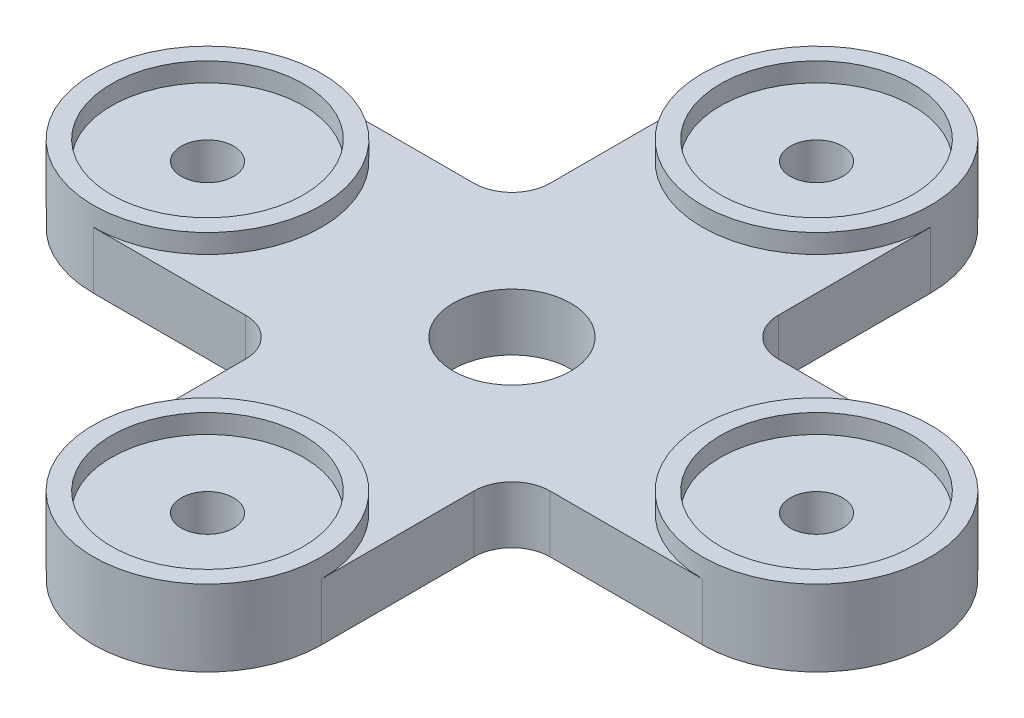
ISO-10303-21;
HEADER;
FILE_DESCRIPTION(('STEP AP214'),'2;1');
FILE_NAME('part.step','',(''),(''),'','','');
FILE_SCHEMA(('AUTOMOTIVE_DESIGN { 1 0 10303 214 1 1 1 1 }'));
ENDSEC;
DATA;
#1=APPLICATION_CONTEXT('core data for automotive mechanical design processes');
#2=APPLICATION_PROTOCOL_DEFINITION('international standard','automotive_design',2000,#1);
#3=PRODUCT_CONTEXT('',#1,'mechanical');
#4=PRODUCT('Part','Part','',(#3));
#5=PRODUCT_RELATED_PRODUCT_CATEGORY('part','',(#4));
#6=PRODUCT_DEFINITION_FORMATION('','',#4);
#7=PRODUCT_DEFINITION_CONTEXT('part definition',#1,'design');
#8=PRODUCT_DEFINITION('design','',#6,#7);
#9=PRODUCT_DEFINITION_SHAPE('','',#8);
#10=(LENGTH_UNIT() NAMED_UNIT(*) SI_UNIT(.MILLI.,.METRE.));
#11=(NAMED_UNIT(*) PLANE_ANGLE_UNIT() SI_UNIT($,.RADIAN.));
#12=(NAMED_UNIT(*) SI_UNIT($,.STERADIAN.) SOLID_ANGLE_UNIT());
#13=UNCERTAINTY_MEASURE_WITH_UNIT(LENGTH_MEASURE(1.E-05),#10,'distance_accuracy_value','');
#14=(GEOMETRIC_REPRESENTATION_CONTEXT(3) GLOBAL_UNCERTAINTY_ASSIGNED_CONTEXT((#13)) GLOBAL_UNIT_ASSIGNED_CONTEXT((#10,
#11,#12)) REPRESENTATION_CONTEXT('',''));
#15=CARTESIAN_POINT('',(0.,0.,0.));
#16=DIRECTION('',(0.,0.,1.));
#17=DIRECTION('',(1.,0.,0.));
#18=AXIS2_PLACEMENT_3D('',#15,#16,#17);
#19=CARTESIAN_POINT('',(7.62000000000001,3.81,0.));
#20=DIRECTION('',(1.,0.,0.));
#21=DIRECTION('',(0.,0.,-1.));
#22=AXIS2_PLACEMENT_3D('',#19,#20,#21);
#23=PLANE('',#22);
#24=DIRECTION('',(0.,0.,1.));
#25=VECTOR('',#24,1.);
#26=CARTESIAN_POINT('',(7.62000000000001,3.81,0.));
#27=LINE('',#26,#25);
#28=CARTESIAN_POINT('',(7.62,3.81,-20.32));
#29=VERTEX_POINT('',#28);
#30=CARTESIAN_POINT('',(7.62,3.81,-10.1600000000001));
#31=VERTEX_POINT('',#30);
#32=EDGE_CURVE('E341',#29,#31,#27,.T.);
#33=ORIENTED_EDGE('',*,*,#32,.T.);
#34=DIRECTION('',(0.,-1.,0.));
#35=VECTOR('',#34,1.);
#36=CARTESIAN_POINT('',(7.62,3.81,-10.1600000000001));
#37=LINE('',#36,#35);
#38=CARTESIAN_POINT('',(7.62,0.,-10.1600000000001));
#39=VERTEX_POINT('',#38);
#40=EDGE_CURVE('E397',#31,#39,#37,.T.);
#41=ORIENTED_EDGE('',*,*,#40,.T.);
#42=DIRECTION('',(0.,0.,1.));
#43=VECTOR('',#42,1.);
#44=CARTESIAN_POINT('',(7.62000000000001,0.,0.));
#45=LINE('',#44,#43);
#46=CARTESIAN_POINT('',(7.62,0.,-20.32));
#47=VERTEX_POINT('',#46);
#48=EDGE_CURVE('E355',#47,#39,#45,.T.);
#49=ORIENTED_EDGE('',*,*,#48,.F.);
#50=DIRECTION('',(0.,-1.,0.));
#51=VECTOR('',#50,1.);
#52=CARTESIAN_POINT('',(7.62,3.81,-20.32));
#53=LINE('',#52,#51);
#54=EDGE_CURVE('E350',#29,#47,#53,.T.);
#55=ORIENTED_EDGE('',*,*,#54,.F.);
#56=EDGE_LOOP('',(#33,#41,#49,#55));
#57=FACE_BOUND('',#56,.T.);
#58=ADVANCED_FACE('F62',(#57),#23,.T.);
#59=CARTESIAN_POINT('',(0.,3.81,0.));
#60=DIRECTION('',(0.,-1.,0.));
#61=DIRECTION('',(0.,0.,-1.));
#62=AXIS2_PLACEMENT_3D('',#59,#60,#61);
#63=CYLINDRICAL_SURFACE('',#62,3.925);
#64=CARTESIAN_POINT('',(0.,3.81,0.));
#65=DIRECTION('',(0.,1.,0.));
#66=DIRECTION('',(0.,0.,1.));
#67=AXIS2_PLACEMENT_3D('',#64,#65,#66);
#68=CIRCLE('',#67,3.925);
#69=CARTESIAN_POINT('',(0.,3.81,-3.925));
#70=VERTEX_POINT('',#69);
#71=EDGE_CURVE('E346',#70,#70,#68,.T.);
#72=CARTESIAN_POINT('',(0.,0.,0.));
#73=DIRECTION('',(0.,1.,0.));
#74=DIRECTION('',(0.,0.,1.));
#75=AXIS2_PLACEMENT_3D('',#72,#73,#74);
#76=CIRCLE('',#75,3.925);
#77=CARTESIAN_POINT('',(0.,0.,-3.925));
#78=VERTEX_POINT('',#77);
#79=EDGE_CURVE('E342',#78,#78,#76,.T.);
#80=CARTESIAN_POINT('',(0.,3.81,-3.925));
#81=CARTESIAN_POINT('',(0.,3.7703125,-3.925));
#82=CARTESIAN_POINT('',(0.,3.730625,-3.925));
#83=CARTESIAN_POINT('',(0.,3.65125,-3.925));
#84=CARTESIAN_POINT('',(0.,3.6115625,-3.925));
#85=CARTESIAN_POINT('',(0.,3.5321875,-3.925));
#86=CARTESIAN_POINT('',(0.,3.4925,-3.925));
#87=CARTESIAN_POINT('',(0.,3.413125,-3.925));
#88=CARTESIAN_POINT('',(0.,3.3734375,-3.925));
#89=CARTESIAN_POINT('',(0.,3.2940625,-3.925));
#90=CARTESIAN_POINT('',(0.,3.254375,-3.925));
#91=CARTESIAN_POINT('',(0.,3.175,-3.925));
#92=CARTESIAN_POINT('',(0.,3.1353125,-3.925));
#93=CARTESIAN_POINT('',(0.,3.0559375,-3.925));
#94=CARTESIAN_POINT('',(0.,3.01625,-3.925));
#95=CARTESIAN_POINT('',(0.,2.936875,-3.925));
#96=CARTESIAN_POINT('',(0.,2.8971875,-3.925));
#97=CARTESIAN_POINT('',(0.,2.8178125,-3.925));
#98=CARTESIAN_POINT('',(0.,2.778125,-3.925));
#99=CARTESIAN_POINT('',(0.,2.69875,-3.925));
#100=CARTESIAN_POINT('',(0.,2.6590625,-3.925));
#101=CARTESIAN_POINT('',(0.,2.5796875,-3.925));
#102=CARTESIAN_POINT('',(0.,2.54,-3.925));
#103=CARTESIAN_POINT('',(0.,2.460625,-3.925));
#104=CARTESIAN_POINT('',(0.,2.4209375,-3.925));
#105=CARTESIAN_POINT('',(0.,2.3415625,-3.925));
#106=CARTESIAN_POINT('',(0.,2.301875,-3.925));
#107=CARTESIAN_POINT('',(0.,2.2225,-3.925));
#108=CARTESIAN_POINT('',(0.,2.1828125,-3.925));
#109=CARTESIAN_POINT('',(0.,2.1034375,-3.925));
#110=CARTESIAN_POINT('',(0.,2.06375,-3.925));
#111=CARTESIAN_POINT('',(0.,1.984375,-3.925));
#112=CARTESIAN_POINT('',(0.,1.9446875,-3.925));
#113=CARTESIAN_POINT('',(0.,1.8653125,-3.925));
#114=CARTESIAN_POINT('',(0.,1.825625,-3.925));
#115=CARTESIAN_POINT('',(0.,1.74625,-3.925));
#116=CARTESIAN_POINT('',(0.,1.7065625,-3.925));
#117=CARTESIAN_POINT('',(0.,1.6271875,-3.925));
#118=CARTESIAN_POINT('',(0.,1.5875,-3.925));
#119=CARTESIAN_POINT('',(0.,1.508125,-3.925));
#120=CARTESIAN_POINT('',(0.,1.4684375,-3.925));
#121=CARTESIAN_POINT('',(0.,1.3890625,-3.925));
#122=CARTESIAN_POINT('',(0.,1.349375,-3.925));
#123=CARTESIAN_POINT('',(0.,1.27,-3.925));
#124=CARTESIAN_POINT('',(0.,1.2303125,-3.925));
#125=CARTESIAN_POINT('',(0.,1.1509375,-3.925));
#126=CARTESIAN_POINT('',(0.,1.11125,-3.925));
#127=CARTESIAN_POINT('',(0.,1.031875,-3.925));
#128=CARTESIAN_POINT('',(0.,0.9921875,-3.925));
#129=CARTESIAN_POINT('',(0.,0.9128125,-3.925));
#130=CARTESIAN_POINT('',(0.,0.873125,-3.925));
#131=CARTESIAN_POINT('',(0.,0.79375,-3.925));
#132=CARTESIAN_POINT('',(0.,0.7540625,-3.925));
#133=CARTESIAN_POINT('',(0.,0.6746875,-3.925));
#134=CARTESIAN_POINT('',(0.,0.635,-3.925));
#135=CARTESIAN_POINT('',(0.,0.555625,-3.925));
#136=CARTESIAN_POINT('',(0.,0.5159375,-3.925));
#137=CARTESIAN_POINT('',(0.,0.4365625,-3.925));
#138=CARTESIAN_POINT('',(0.,0.396875,-3.925));
#139=CARTESIAN_POINT('',(0.,0.3175,-3.925));
#140=CARTESIAN_POINT('',(0.,0.2778125,-3.925));
#141=CARTESIAN_POINT('',(0.,0.1984375,-3.925));
#142=CARTESIAN_POINT('',(0.,0.15875,-3.925));
#143=CARTESIAN_POINT('',(0.,0.0793749999999999,-3.925));
#144=CARTESIAN_POINT('',(0.,0.0396874999999999,-3.925));
#145=CARTESIAN_POINT('',(0.,0.,-3.925));
#146=B_SPLINE_CURVE_WITH_KNOTS('',3,(#80,#81,#82,#83,#84,#85,#86,#87,#88,#89,#90,#91,#92,#93,
#94,#95,#96,#97,#98,#99,#100,#101,#102,#103,#104,#105,#106,#107,#108,#109,#110,#111,#112,#113,
#114,#115,#116,#117,#118,#119,#120,#121,#122,#123,#124,#125,#126,#127,#128,#129,#130,#131,#132,
#133,#134,#135,#136,#137,#138,#139,#140,#141,#142,#143,#144,#145),.UNSPECIFIED.,.F.,.F.,(4,2,2,
2,2,2,2,2,2,2,2,2,2,2,2,2,2,2,2,2,2,2,2,2,2,2,2,2,2,2,2,2,4),(0.,0.1190625,0.238125,0.3571875,
0.47625,0.595312499999999,0.714375,0.833437499999999,0.952499999999999,1.0715625,1.190625,
1.3096875,1.42875,1.5478125,1.666875,1.7859375,1.905,2.0240625,2.143125,2.2621875,2.38125,
2.5003125,2.619375,2.7384375,2.8575,2.9765625,3.095625,3.2146875,3.33375,3.4528125,3.571875,
3.6909375,3.81),.UNSPECIFIED.);
#147=EDGE_CURVE('BSEAM503',#70,#78,#146,.T.);
#148=ORIENTED_EDGE('',*,*,#71,.T.);
#149=ORIENTED_EDGE('',*,*,#79,.F.);
#150=ORIENTED_EDGE('',*,*,#147,.T.);
#151=ORIENTED_EDGE('',*,*,#147,.F.);
#152=EDGE_LOOP('',(#148,#150,#149,#151));
#153=FACE_BOUND('',#152,.T.);
#154=ADVANCED_FACE('F503',(#153),#63,.F.);
#155=CARTESIAN_POINT('',(-7.61999999999999,3.81,0.));
#156=DIRECTION('',(1.,0.,0.));
#157=DIRECTION('',(0.,0.,-1.));
#158=AXIS2_PLACEMENT_3D('',#155,#156,#157);
#159=PLANE('',#158);
#160=DIRECTION('',(0.,0.,1.));
#161=VECTOR('',#160,1.);
#162=CARTESIAN_POINT('',(-7.61999999999999,0.,0.));
#163=LINE('',#162,#161);
#164=CARTESIAN_POINT('',(-7.62,0.,-20.32));
#165=VERTEX_POINT('',#164);
#166=CARTESIAN_POINT('',(-7.62,0.,-10.16));
#167=VERTEX_POINT('',#166);
#168=EDGE_CURVE('E351',#165,#167,#163,.T.);
#169=ORIENTED_EDGE('',*,*,#168,.T.);
#170=DIRECTION('',(0.,1.,0.));
#171=VECTOR('',#170,1.);
#172=CARTESIAN_POINT('',(-7.62,3.81,-10.16));
#173=LINE('',#172,#171);
#174=CARTESIAN_POINT('',(-7.62,3.81,-10.16));
#175=VERTEX_POINT('',#174);
#176=EDGE_CURVE('E390',#167,#175,#173,.T.);
#177=ORIENTED_EDGE('',*,*,#176,.T.);
#178=DIRECTION('',(0.,0.,1.));
#179=VECTOR('',#178,1.);
#180=CARTESIAN_POINT('',(-7.61999999999999,3.81,0.));
#181=LINE('',#180,#179);
#182=CARTESIAN_POINT('',(-7.62,3.81,-20.32));
#183=VERTEX_POINT('',#182);
#184=EDGE_CURVE('E338',#183,#175,#181,.T.);
#185=ORIENTED_EDGE('',*,*,#184,.F.);
#186=DIRECTION('',(0.,-1.,0.));
#187=VECTOR('',#186,1.);
#188=CARTESIAN_POINT('',(-7.62,3.81,-20.32));
#189=LINE('',#188,#187);
#190=EDGE_CURVE('E363',#183,#165,#189,.T.);
#191=ORIENTED_EDGE('',*,*,#190,.T.);
#192=EDGE_LOOP('',(#169,#177,#185,#191));
#193=FACE_BOUND('',#192,.T.);
#194=ADVANCED_FACE('F431',(#193),#159,.F.);
#195=CARTESIAN_POINT('',(0.,0.,0.));
#196=DIRECTION('',(0.,1.,0.));
#197=DIRECTION('',(0.,0.,1.));
#198=AXIS2_PLACEMENT_3D('',#195,#196,#197);
#199=PLANE('',#198);
#200=DIRECTION('',(1.,0.,0.));
#201=VECTOR('',#200,1.);
#202=CARTESIAN_POINT('',(0.,0.,-7.62000000000001));
#203=LINE('',#202,#201);
#204=CARTESIAN_POINT('',(-20.32,0.,-7.61999999999993));
#205=VERTEX_POINT('',#204);
#206=CARTESIAN_POINT('',(-10.16,0.,-7.61999999999997));
#207=VERTEX_POINT('',#206);
#208=EDGE_CURVE('E294',#205,#207,#203,.T.);
#209=ORIENTED_EDGE('',*,*,#208,.T.);
#210=CARTESIAN_POINT('',(-10.16,0.,-10.16));
#211=DIRECTION('',(0.,1.,0.));
#212=DIRECTION('',(0.,0.,1.));
#213=AXIS2_PLACEMENT_3D('',#210,#211,#212);
#214=CIRCLE('',#213,2.54);
#215=EDGE_CURVE('E417',#207,#167,#214,.T.);
#216=ORIENTED_EDGE('',*,*,#215,.T.);
#217=ORIENTED_EDGE('',*,*,#168,.F.);
#218=CARTESIAN_POINT('',(0.,0.,-20.32));
#219=DIRECTION('',(0.,1.,0.));
#220=DIRECTION('',(0.,0.,1.));
#221=AXIS2_PLACEMENT_3D('',#218,#219,#220);
#222=CIRCLE('',#221,7.62);
#223=EDGE_CURVE('E337',#47,#165,#222,.T.);
#224=ORIENTED_EDGE('',*,*,#223,.F.);
#225=ORIENTED_EDGE('',*,*,#48,.T.);
#226=CARTESIAN_POINT('',(10.16,0.,-10.1600000000001));
#227=DIRECTION('',(0.,1.,0.));
#228=DIRECTION('',(0.,0.,1.));
#229=AXIS2_PLACEMENT_3D('',#226,#227,#228);
#230=CIRCLE('',#229,2.54);
#231=CARTESIAN_POINT('',(10.16,0.,-7.6200000000001));
#232=VERTEX_POINT('',#231);
#233=EDGE_CURVE('E71',#39,#232,#230,.T.);
#234=ORIENTED_EDGE('',*,*,#233,.T.);
#235=DIRECTION('',(-1.,0.,0.));
#236=VECTOR('',#235,1.);
#237=CARTESIAN_POINT('',(0.,0.,-7.61999999999999));
#238=LINE('',#237,#236);
#239=CARTESIAN_POINT('',(20.3199999999999,0.,-7.62000000000021));
#240=VERTEX_POINT('',#239);
#241=EDGE_CURVE('E210',#240,#232,#238,.T.);
#242=ORIENTED_EDGE('',*,*,#241,.F.);
#243=CARTESIAN_POINT('',(20.32,0.,-2.12840702415877E-13));
#244=DIRECTION('',(0.,1.,0.));
#245=DIRECTION('',(-1.,0.,0.));
#246=AXIS2_PLACEMENT_3D('',#243,#244,#245);
#247=CIRCLE('',#246,7.62);
#248=CARTESIAN_POINT('',(20.3200000000001,0.,7.61999999999979));
#249=VERTEX_POINT('',#248);
#250=EDGE_CURVE('E213',#249,#240,#247,.T.);
#251=ORIENTED_EDGE('',*,*,#250,.F.);
#252=DIRECTION('',(-1.,0.,0.));
#253=VECTOR('',#252,1.);
#254=CARTESIAN_POINT('',(0.,0.,7.62000000000001));
#255=LINE('',#254,#253);
#256=CARTESIAN_POINT('',(10.16,0.,7.6199999999999));
#257=VERTEX_POINT('',#256);
#258=EDGE_CURVE('E195',#249,#257,#255,.T.);
#259=ORIENTED_EDGE('',*,*,#258,.T.);
#260=CARTESIAN_POINT('',(10.16,0.,10.1599999999999));
#261=DIRECTION('',(0.,1.,0.));
#262=DIRECTION('',(0.,0.,1.));
#263=AXIS2_PLACEMENT_3D('',#260,#261,#262);
#264=CIRCLE('',#263,2.54);
#265=CARTESIAN_POINT('',(7.62,0.,10.1599999999999));
#266=VERTEX_POINT('',#265);
#267=EDGE_CURVE('E411',#257,#266,#264,.T.);
#268=ORIENTED_EDGE('',*,*,#267,.T.);
#269=DIRECTION('',(0.,0.,-1.));
#270=VECTOR('',#269,1.);
#271=CARTESIAN_POINT('',(7.61999999999999,0.,0.));
#272=LINE('',#271,#270);
#273=CARTESIAN_POINT('',(7.62,0.,20.32));
#274=VERTEX_POINT('',#273);
#275=EDGE_CURVE('E250',#274,#266,#272,.T.);
#276=ORIENTED_EDGE('',*,*,#275,.F.);
#277=CARTESIAN_POINT('',(0.,0.,20.32));
#278=DIRECTION('',(0.,1.,0.));
#279=DIRECTION('',(0.,0.,-1.));
#280=AXIS2_PLACEMENT_3D('',#277,#278,#279);
#281=CIRCLE('',#280,7.62);
#282=CARTESIAN_POINT('',(-7.62,0.,20.32));
#283=VERTEX_POINT('',#282);
#284=EDGE_CURVE('E240',#283,#274,#281,.T.);
#285=ORIENTED_EDGE('',*,*,#284,.F.);
#286=DIRECTION('',(0.,0.,-1.));
#287=VECTOR('',#286,1.);
#288=CARTESIAN_POINT('',(-7.62000000000001,0.,0.));
#289=LINE('',#288,#287);
#290=CARTESIAN_POINT('',(-7.62,0.,10.16));
#291=VERTEX_POINT('',#290);
#292=EDGE_CURVE('E245',#283,#291,#289,.T.);
#293=ORIENTED_EDGE('',*,*,#292,.T.);
#294=CARTESIAN_POINT('',(-10.16,0.,10.16));
#295=DIRECTION('',(0.,1.,0.));
#296=DIRECTION('',(0.,0.,1.));
#297=AXIS2_PLACEMENT_3D('',#294,#295,#296);
#298=CIRCLE('',#297,2.54);
#299=CARTESIAN_POINT('',(-10.16,0.,7.62000000000003));
#300=VERTEX_POINT('',#299);
#301=EDGE_CURVE('E406',#291,#300,#298,.T.);
#302=ORIENTED_EDGE('',*,*,#301,.T.);
#303=DIRECTION('',(1.,0.,0.));
#304=VECTOR('',#303,1.);
#305=CARTESIAN_POINT('',(0.,0.,7.61999999999999));
#306=LINE('',#305,#304);
#307=CARTESIAN_POINT('',(-20.32,0.,7.62000000000007));
#308=VERTEX_POINT('',#307);
#309=EDGE_CURVE('E299',#308,#300,#306,.T.);
#310=ORIENTED_EDGE('',*,*,#309,.F.);
#311=CARTESIAN_POINT('',(-20.32,0.,0.));
#312=DIRECTION('',(0.,1.,0.));
#313=DIRECTION('',(1.,0.,0.));
#314=AXIS2_PLACEMENT_3D('',#311,#312,#313);
#315=CIRCLE('',#314,7.62);
#316=EDGE_CURVE('E288',#205,#308,#315,.T.);
#317=ORIENTED_EDGE('',*,*,#316,.F.);
#318=EDGE_LOOP('',(#209,#216,#217,#224,#225,#234,#242,#251,#259,#268,#276,#285,#293,#302,#310,#317));
#319=FACE_BOUND('',#318,.T.);
#320=CARTESIAN_POINT('',(0.,0.,-20.32));
#321=DIRECTION('',(0.,1.,0.));
#322=DIRECTION('',(0.,0.,1.));
#323=AXIS2_PLACEMENT_3D('',#320,#321,#322);
#324=CIRCLE('',#323,1.750000056);
#325=CARTESIAN_POINT('',(0.,0.,-18.569999944));
#326=VERTEX_POINT('',#325);
#327=EDGE_CURVE('E325',#326,#326,#324,.T.);
#328=ORIENTED_EDGE('',*,*,#327,.T.);
#329=EDGE_LOOP('',(#328));
#330=FACE_BOUND('',#329,.T.);
#331=ORIENTED_EDGE('',*,*,#79,.T.);
#332=EDGE_LOOP('',(#331));
#333=FACE_BOUND('',#332,.T.);
#334=CARTESIAN_POINT('',(0.,0.,20.32));
#335=DIRECTION('',(0.,1.,0.));
#336=DIRECTION('',(0.,0.,-1.));
#337=AXIS2_PLACEMENT_3D('',#334,#335,#336);
#338=CIRCLE('',#337,1.750000056);
#339=CARTESIAN_POINT('',(0.,0.,18.569999944));
#340=VERTEX_POINT('',#339);
#341=EDGE_CURVE('E228',#340,#340,#338,.T.);
#342=ORIENTED_EDGE('',*,*,#341,.T.);
#343=EDGE_LOOP('',(#342));
#344=FACE_BOUND('',#343,.T.);
#345=CARTESIAN_POINT('',(20.32,0.,-2.12840702415877E-13));
#346=DIRECTION('',(0.,1.,0.));
#347=DIRECTION('',(-1.,0.,0.));
#348=AXIS2_PLACEMENT_3D('',#345,#346,#347);
#349=CIRCLE('',#348,1.750000056);
#350=CARTESIAN_POINT('',(18.569999944,0.,-1.94510424800382E-13));
#351=VERTEX_POINT('',#350);
#352=EDGE_CURVE('E851',#351,#351,#349,.T.);
#353=ORIENTED_EDGE('',*,*,#352,.T.);
#354=EDGE_LOOP('',(#353));
#355=FACE_BOUND('',#354,.T.);
#356=CARTESIAN_POINT('',(-20.32,0.,0.));
#357=DIRECTION('',(0.,1.,0.));
#358=DIRECTION('',(1.,0.,0.));
#359=AXIS2_PLACEMENT_3D('',#356,#357,#358);
#360=CIRCLE('',#359,1.750000056);
#361=CARTESIAN_POINT('',(-18.569999944,0.,0.));
#362=VERTEX_POINT('',#361);
#363=EDGE_CURVE('E276',#362,#362,#360,.T.);
#364=ORIENTED_EDGE('',*,*,#363,.T.);
#365=EDGE_LOOP('',(#364));
#366=FACE_BOUND('',#365,.T.);
#367=ADVANCED_FACE('F422',(#319,#330,#333,#344,#355,#366),#199,.F.);
#368=CARTESIAN_POINT('',(0.,3.81,0.));
#369=DIRECTION('',(0.,1.,0.));
#370=DIRECTION('',(0.,0.,1.));
#371=AXIS2_PLACEMENT_3D('',#368,#369,#370);
#372=PLANE('',#371);
#373=ORIENTED_EDGE('',*,*,#184,.T.);
#374=CARTESIAN_POINT('',(-10.16,3.81,-10.16));
#375=DIRECTION('',(0.,1.,0.));
#376=DIRECTION('',(0.,0.,1.));
#377=AXIS2_PLACEMENT_3D('',#374,#375,#376);
#378=CIRCLE('',#377,2.54);
#379=CARTESIAN_POINT('',(-10.16,3.81,-7.61999999999997));
#380=VERTEX_POINT('',#379);
#381=EDGE_CURVE('E414',#175,#380,#378,.F.);
#382=ORIENTED_EDGE('',*,*,#381,.T.);
#383=DIRECTION('',(1.,0.,0.));
#384=VECTOR('',#383,1.);
#385=CARTESIAN_POINT('',(0.,3.81,-7.62000000000001));
#386=LINE('',#385,#384);
#387=CARTESIAN_POINT('',(-20.32,3.81,-7.61999999999993));
#388=VERTEX_POINT('',#387);
#389=EDGE_CURVE('E293',#388,#380,#386,.T.);
#390=ORIENTED_EDGE('',*,*,#389,.F.);
#391=CARTESIAN_POINT('',(-20.32,3.81,0.));
#392=DIRECTION('',(0.,1.,0.));
#393=DIRECTION('',(1.,0.,0.));
#394=AXIS2_PLACEMENT_3D('',#391,#392,#393);
#395=CIRCLE('',#394,7.62);
#396=CARTESIAN_POINT('',(-20.32,3.81,7.62000000000007));
#397=VERTEX_POINT('',#396);
#398=EDGE_CURVE('E311',#388,#397,#395,.F.);
#399=ORIENTED_EDGE('',*,*,#398,.T.);
#400=DIRECTION('',(1.,0.,0.));
#401=VECTOR('',#400,1.);
#402=CARTESIAN_POINT('',(0.,3.81,7.61999999999999));
#403=LINE('',#402,#401);
#404=CARTESIAN_POINT('',(-10.16,3.81,7.62000000000003));
#405=VERTEX_POINT('',#404);
#406=EDGE_CURVE('E289',#397,#405,#403,.T.);
#407=ORIENTED_EDGE('',*,*,#406,.T.);
#408=CARTESIAN_POINT('',(-10.16,3.81,10.16));
#409=DIRECTION('',(0.,1.,0.));
#410=DIRECTION('',(0.,0.,1.));
#411=AXIS2_PLACEMENT_3D('',#408,#409,#410);
#412=CIRCLE('',#411,2.54);
#413=CARTESIAN_POINT('',(-7.62,3.81,10.16));
#414=VERTEX_POINT('',#413);
#415=EDGE_CURVE('E403',#405,#414,#412,.F.);
#416=ORIENTED_EDGE('',*,*,#415,.T.);
#417=DIRECTION('',(0.,0.,-1.));
#418=VECTOR('',#417,1.);
#419=CARTESIAN_POINT('',(-7.62000000000001,3.81,0.));
#420=LINE('',#419,#418);
#421=CARTESIAN_POINT('',(-7.62,3.81,20.32));
#422=VERTEX_POINT('',#421);
#423=EDGE_CURVE('E244',#422,#414,#420,.T.);
#424=ORIENTED_EDGE('',*,*,#423,.F.);
#425=CARTESIAN_POINT('',(0.,3.81,20.32));
#426=DIRECTION('',(0.,1.,0.));
#427=DIRECTION('',(0.,0.,-1.));
#428=AXIS2_PLACEMENT_3D('',#425,#426,#427);
#429=CIRCLE('',#428,7.62);
#430=CARTESIAN_POINT('',(7.62,3.81,20.32));
#431=VERTEX_POINT('',#430);
#432=EDGE_CURVE('E262',#422,#431,#429,.F.);
#433=ORIENTED_EDGE('',*,*,#432,.T.);
#434=DIRECTION('',(0.,0.,-1.));
#435=VECTOR('',#434,1.);
#436=CARTESIAN_POINT('',(7.61999999999999,3.81,0.));
#437=LINE('',#436,#435);
#438=CARTESIAN_POINT('',(7.62,3.81,10.1599999999999));
#439=VERTEX_POINT('',#438);
#440=EDGE_CURVE('E241',#431,#439,#437,.T.);
#441=ORIENTED_EDGE('',*,*,#440,.T.);
#442=CARTESIAN_POINT('',(10.16,3.81,10.1599999999999));
#443=DIRECTION('',(0.,1.,0.));
#444=DIRECTION('',(0.,0.,1.));
#445=AXIS2_PLACEMENT_3D('',#442,#443,#444);
#446=CIRCLE('',#445,2.54);
#447=CARTESIAN_POINT('',(10.16,3.81,7.6199999999999));
#448=VERTEX_POINT('',#447);
#449=EDGE_CURVE('E202',#439,#448,#446,.F.);
#450=ORIENTED_EDGE('',*,*,#449,.T.);
#451=DIRECTION('',(-1.,0.,0.));
#452=VECTOR('',#451,1.);
#453=CARTESIAN_POINT('',(0.,3.81,7.62000000000001));
#454=LINE('',#453,#452);
#455=CARTESIAN_POINT('',(20.3200000000001,3.81,7.61999999999979));
#456=VERTEX_POINT('',#455);
#457=EDGE_CURVE('E192',#456,#448,#454,.T.);
#458=ORIENTED_EDGE('',*,*,#457,.F.);
#459=CARTESIAN_POINT('',(20.32,3.81,-2.12840702415877E-13));
#460=DIRECTION('',(0.,1.,0.));
#461=DIRECTION('',(-1.,0.,0.));
#462=AXIS2_PLACEMENT_3D('',#459,#460,#461);
#463=CIRCLE('',#462,7.62);
#464=CARTESIAN_POINT('',(20.3199999999999,3.81,-7.62000000000021));
#465=VERTEX_POINT('',#464);
#466=EDGE_CURVE('E175',#456,#465,#463,.F.);
#467=ORIENTED_EDGE('',*,*,#466,.T.);
#468=DIRECTION('',(-1.,0.,0.));
#469=VECTOR('',#468,1.);
#470=CARTESIAN_POINT('',(0.,3.81,-7.61999999999999));
#471=LINE('',#470,#469);
#472=CARTESIAN_POINT('',(10.16,3.81,-7.6200000000001));
#473=VERTEX_POINT('',#472);
#474=EDGE_CURVE('E204',#465,#473,#471,.T.);
#475=ORIENTED_EDGE('',*,*,#474,.T.);
#476=CARTESIAN_POINT('',(10.16,3.81,-10.1600000000001));
#477=DIRECTION('',(0.,1.,0.));
#478=DIRECTION('',(0.,0.,1.));
#479=AXIS2_PLACEMENT_3D('',#476,#477,#478);
#480=CIRCLE('',#479,2.54);
#481=EDGE_CURVE('E12',#473,#31,#480,.F.);
#482=ORIENTED_EDGE('',*,*,#481,.T.);
#483=ORIENTED_EDGE('',*,*,#32,.F.);
#484=CARTESIAN_POINT('',(0.,3.81,-20.32));
#485=DIRECTION('',(0.,1.,0.));
#486=DIRECTION('',(0.,0.,1.));
#487=AXIS2_PLACEMENT_3D('',#484,#485,#486);
#488=CIRCLE('',#487,7.62);
#489=EDGE_CURVE('E366',#29,#183,#488,.F.);
#490=ORIENTED_EDGE('',*,*,#489,.T.);
#491=EDGE_LOOP('',(#373,#382,#390,#399,#407,#416,#424,#433,#441,#450,#458,#467,#475,#482,#483,#490));
#492=FACE_BOUND('',#491,.T.);
#493=ORIENTED_EDGE('',*,*,#71,.F.);
#494=EDGE_LOOP('',(#493));
#495=FACE_BOUND('',#494,.T.);
#496=ADVANCED_FACE('F199',(#492,#495),#372,.T.);
#497=CARTESIAN_POINT('',(0.,3.81,-20.32));
#498=DIRECTION('',(0.,-1.,0.));
#499=DIRECTION('',(0.,0.,-1.));
#500=AXIS2_PLACEMENT_3D('',#497,#498,#499);
#501=CYLINDRICAL_SURFACE('',#500,7.62);
#502=ORIENTED_EDGE('',*,*,#223,.T.);
#503=ORIENTED_EDGE('',*,*,#190,.F.);
#504=ORIENTED_EDGE('',*,*,#489,.F.);
#505=ORIENTED_EDGE('',*,*,#54,.T.);
#506=EDGE_LOOP('',(#502,#503,#504,#505));
#507=FACE_BOUND('',#506,.T.);
#508=CARTESIAN_POINT('',(0.,5.08,-20.32));
#509=DIRECTION('',(0.,1.,0.));
#510=DIRECTION('',(0.,0.,1.));
#511=AXIS2_PLACEMENT_3D('',#508,#509,#510);
#512=CIRCLE('',#511,7.62);
#513=CARTESIAN_POINT('',(0.,5.08,-12.7));
#514=VERTEX_POINT('',#513);
#515=EDGE_CURVE('E333',#514,#514,#512,.T.);
#516=ORIENTED_EDGE('',*,*,#515,.F.);
#517=EDGE_LOOP('',(#516));
#518=FACE_BOUND('',#517,.T.);
#519=ADVANCED_FACE('F479',(#507,#518),#501,.T.);
#520=CARTESIAN_POINT('',(0.,5.08,-20.32));
#521=DIRECTION('',(0.,-1.,0.));
#522=DIRECTION('',(0.,0.,-1.));
#523=AXIS2_PLACEMENT_3D('',#520,#521,#522);
#524=CYLINDRICAL_SURFACE('',#523,6.4135);
#525=CARTESIAN_POINT('',(0.,3.81,-20.32));
#526=DIRECTION('',(0.,1.,0.));
#527=DIRECTION('',(0.,0.,1.));
#528=AXIS2_PLACEMENT_3D('',#525,#526,#527);
#529=CIRCLE('',#528,6.4135);
#530=CARTESIAN_POINT('',(0.,3.81,-13.9065));
#531=VERTEX_POINT('',#530);
#532=EDGE_CURVE('E372',#531,#531,#529,.F.);
#533=ORIENTED_EDGE('',*,*,#532,.T.);
#534=EDGE_LOOP('',(#533));
#535=FACE_BOUND('',#534,.T.);
#536=CARTESIAN_POINT('',(0.,5.08,-20.32));
#537=DIRECTION('',(0.,1.,0.));
#538=DIRECTION('',(0.,0.,1.));
#539=AXIS2_PLACEMENT_3D('',#536,#537,#538);
#540=CIRCLE('',#539,6.4135);
#541=CARTESIAN_POINT('',(0.,5.08,-13.9065));
#542=VERTEX_POINT('',#541);
#543=EDGE_CURVE('E329',#542,#542,#540,.T.);
#544=ORIENTED_EDGE('',*,*,#543,.T.);
#545=EDGE_LOOP('',(#544));
#546=FACE_BOUND('',#545,.T.);
#547=ADVANCED_FACE('F482',(#535,#546),#524,.F.);
#548=CARTESIAN_POINT('',(0.,5.08,0.));
#549=DIRECTION('',(0.,1.,0.));
#550=DIRECTION('',(0.,0.,1.));
#551=AXIS2_PLACEMENT_3D('',#548,#549,#550);
#552=PLANE('',#551);
#553=ORIENTED_EDGE('',*,*,#543,.F.);
#554=EDGE_LOOP('',(#553));
#555=FACE_BOUND('',#554,.T.);
#556=ORIENTED_EDGE('',*,*,#515,.T.);
#557=EDGE_LOOP('',(#556));
#558=FACE_BOUND('',#557,.T.);
#559=ADVANCED_FACE('F486',(#555,#558),#552,.T.);
#560=CARTESIAN_POINT('',(0.,3.81,-20.32));
#561=DIRECTION('',(0.,1.,0.));
#562=DIRECTION('',(0.,0.,1.));
#563=AXIS2_PLACEMENT_3D('',#560,#561,#562);
#564=CIRCLE('',#563,1.750000056);
#565=CARTESIAN_POINT('',(0.,3.81,-18.569999944));
#566=VERTEX_POINT('',#565);
#567=EDGE_CURVE('E321',#566,#566,#564,.T.);
#568=ORIENTED_EDGE('',*,*,#567,.F.);
#569=EDGE_LOOP('',(#568));
#570=FACE_BOUND('',#569,.T.);
#571=ORIENTED_EDGE('',*,*,#532,.F.);
#572=EDGE_LOOP('',(#571));
#573=FACE_BOUND('',#572,.T.);
#574=ADVANCED_FACE('F488',(#570,#573),#372,.T.);
#575=CARTESIAN_POINT('',(0.,3.81,-20.32));
#576=DIRECTION('',(0.,1.,0.));
#577=DIRECTION('',(0.,0.,1.));
#578=AXIS2_PLACEMENT_3D('',#575,#576,#577);
#579=CYLINDRICAL_SURFACE('',#578,1.750000056);
#580=ORIENTED_EDGE('',*,*,#327,.F.);
#581=EDGE_LOOP('',(#580));
#582=FACE_BOUND('',#581,.T.);
#583=ORIENTED_EDGE('',*,*,#567,.T.);
#584=EDGE_LOOP('',(#583));
#585=FACE_BOUND('',#584,.T.);
#586=ADVANCED_FACE('F495',(#582,#585),#579,.F.);
#587=CARTESIAN_POINT('',(0.,3.81,-7.62000000000001));
#588=DIRECTION('',(0.,0.,-1.));
#589=DIRECTION('',(-1.,0.,0.));
#590=AXIS2_PLACEMENT_3D('',#587,#588,#589);
#591=PLANE('',#590);
#592=ORIENTED_EDGE('',*,*,#389,.T.);
#593=DIRECTION('',(0.,1.,0.));
#594=VECTOR('',#593,1.);
#595=CARTESIAN_POINT('',(-10.16,3.81,-7.61999999999997));
#596=LINE('',#595,#594);
#597=EDGE_CURVE('E394',#380,#207,#596,.F.);
#598=ORIENTED_EDGE('',*,*,#597,.T.);
#599=ORIENTED_EDGE('',*,*,#208,.F.);
#600=DIRECTION('',(0.,-1.,0.));
#601=VECTOR('',#600,1.);
#602=CARTESIAN_POINT('',(-20.32,3.81,-7.61999999999993));
#603=LINE('',#602,#601);
#604=EDGE_CURVE('E298',#388,#205,#603,.T.);
#605=ORIENTED_EDGE('',*,*,#604,.F.);
#606=EDGE_LOOP('',(#592,#598,#599,#605));
#607=FACE_BOUND('',#606,.T.);
#608=ADVANCED_FACE('F438',(#607),#591,.T.);
#609=CARTESIAN_POINT('',(0.,3.81,7.61999999999999));
#610=DIRECTION('',(0.,0.,-1.));
#611=DIRECTION('',(-1.,0.,0.));
#612=AXIS2_PLACEMENT_3D('',#609,#610,#611);
#613=PLANE('',#612);
#614=ORIENTED_EDGE('',*,*,#309,.T.);
#615=DIRECTION('',(0.,1.,0.));
#616=VECTOR('',#615,1.);
#617=CARTESIAN_POINT('',(-10.16,3.81,7.62000000000003));
#618=LINE('',#617,#616);
#619=EDGE_CURVE('E376',#300,#405,#618,.T.);
#620=ORIENTED_EDGE('',*,*,#619,.T.);
#621=ORIENTED_EDGE('',*,*,#406,.F.);
#622=DIRECTION('',(0.,-1.,0.));
#623=VECTOR('',#622,1.);
#624=CARTESIAN_POINT('',(-20.32,3.81,7.62000000000007));
#625=LINE('',#624,#623);
#626=EDGE_CURVE('E308',#397,#308,#625,.T.);
#627=ORIENTED_EDGE('',*,*,#626,.T.);
#628=EDGE_LOOP('',(#614,#620,#621,#627));
#629=FACE_BOUND('',#628,.T.);
#630=ADVANCED_FACE('F447',(#629),#613,.F.);
#631=CARTESIAN_POINT('',(-20.32,3.81,0.));
#632=DIRECTION('',(0.,-1.,0.));
#633=DIRECTION('',(-1.,0.,0.));
#634=AXIS2_PLACEMENT_3D('',#631,#632,#633);
#635=CYLINDRICAL_SURFACE('',#634,7.62);
#636=ORIENTED_EDGE('',*,*,#316,.T.);
#637=ORIENTED_EDGE('',*,*,#626,.F.);
#638=ORIENTED_EDGE('',*,*,#398,.F.);
#639=ORIENTED_EDGE('',*,*,#604,.T.);
#640=EDGE_LOOP('',(#636,#637,#638,#639));
#641=FACE_BOUND('',#640,.T.);
#642=CARTESIAN_POINT('',(-20.32,5.08,0.));
#643=DIRECTION('',(0.,1.,0.));
#644=DIRECTION('',(1.,0.,0.));
#645=AXIS2_PLACEMENT_3D('',#642,#643,#644);
#646=CIRCLE('',#645,7.62);
#647=CARTESIAN_POINT('',(-12.7,5.08,0.));
#648=VERTEX_POINT('',#647);
#649=EDGE_CURVE('E284',#648,#648,#646,.T.);
#650=ORIENTED_EDGE('',*,*,#649,.F.);
#651=EDGE_LOOP('',(#650));
#652=FACE_BOUND('',#651,.T.);
#653=ADVANCED_FACE('F440',(#641,#652),#635,.T.);
#654=CARTESIAN_POINT('',(-20.32,5.08,0.));
#655=DIRECTION('',(0.,-1.,0.));
#656=DIRECTION('',(-1.,0.,0.));
#657=AXIS2_PLACEMENT_3D('',#654,#655,#656);
#658=CYLINDRICAL_SURFACE('',#657,6.4135);
#659=CARTESIAN_POINT('',(-20.32,3.81,0.));
#660=DIRECTION('',(0.,1.,0.));
#661=DIRECTION('',(1.,0.,0.));
#662=AXIS2_PLACEMENT_3D('',#659,#660,#661);
#663=CIRCLE('',#662,6.4135);
#664=CARTESIAN_POINT('',(-13.9065,3.81,0.));
#665=VERTEX_POINT('',#664);
#666=EDGE_CURVE('E317',#665,#665,#663,.F.);
#667=ORIENTED_EDGE('',*,*,#666,.T.);
#668=EDGE_LOOP('',(#667));
#669=FACE_BOUND('',#668,.T.);
#670=CARTESIAN_POINT('',(-20.32,5.08,0.));
#671=DIRECTION('',(0.,1.,0.));
#672=DIRECTION('',(1.,0.,0.));
#673=AXIS2_PLACEMENT_3D('',#670,#671,#672);
#674=CIRCLE('',#673,6.4135);
#675=CARTESIAN_POINT('',(-13.9065,5.08,0.));
#676=VERTEX_POINT('',#675);
#677=EDGE_CURVE('E280',#676,#676,#674,.T.);
#678=ORIENTED_EDGE('',*,*,#677,.T.);
#679=EDGE_LOOP('',(#678));
#680=FACE_BOUND('',#679,.T.);
#681=ADVANCED_FACE('F659',(#669,#680),#658,.F.);
#682=CARTESIAN_POINT('',(0.,5.08,0.));
#683=DIRECTION('',(0.,1.,0.));
#684=DIRECTION('',(1.,0.,0.));
#685=AXIS2_PLACEMENT_3D('',#682,#683,#684);
#686=PLANE('',#685);
#687=ORIENTED_EDGE('',*,*,#677,.F.);
#688=EDGE_LOOP('',(#687));
#689=FACE_BOUND('',#688,.T.);
#690=ORIENTED_EDGE('',*,*,#649,.T.);
#691=EDGE_LOOP('',(#690));
#692=FACE_BOUND('',#691,.T.);
#693=ADVANCED_FACE('F650',(#689,#692),#686,.T.);
#694=CARTESIAN_POINT('',(0.,3.81,0.));
#695=DIRECTION('',(0.,1.,0.));
#696=DIRECTION('',(1.,0.,0.));
#697=AXIS2_PLACEMENT_3D('',#694,#695,#696);
#698=PLANE('',#697);
#699=CARTESIAN_POINT('',(-20.32,3.81,0.));
#700=DIRECTION('',(0.,1.,0.));
#701=DIRECTION('',(1.,0.,0.));
#702=AXIS2_PLACEMENT_3D('',#699,#700,#701);
#703=CIRCLE('',#702,1.750000056);
#704=CARTESIAN_POINT('',(-18.569999944,3.81,0.));
#705=VERTEX_POINT('',#704);
#706=EDGE_CURVE('E272',#705,#705,#703,.T.);
#707=ORIENTED_EDGE('',*,*,#706,.F.);
#708=EDGE_LOOP('',(#707));
#709=FACE_BOUND('',#708,.T.);
#710=ORIENTED_EDGE('',*,*,#666,.F.);
#711=EDGE_LOOP('',(#710));
#712=FACE_BOUND('',#711,.T.);
#713=ADVANCED_FACE('F640',(#709,#712),#698,.T.);
#714=CARTESIAN_POINT('',(-20.32,3.81,0.));
#715=DIRECTION('',(0.,1.,0.));
#716=DIRECTION('',(1.,0.,0.));
#717=AXIS2_PLACEMENT_3D('',#714,#715,#716);
#718=CYLINDRICAL_SURFACE('',#717,1.750000056);
#719=ORIENTED_EDGE('',*,*,#363,.F.);
#720=EDGE_LOOP('',(#719));
#721=FACE_BOUND('',#720,.T.);
#722=ORIENTED_EDGE('',*,*,#706,.T.);
#723=EDGE_LOOP('',(#722));
#724=FACE_BOUND('',#723,.T.);
#725=ADVANCED_FACE('F636',(#721,#724),#718,.F.);
#726=CARTESIAN_POINT('',(-7.62000000000001,3.81,0.));
#727=DIRECTION('',(-1.,0.,0.));
#728=DIRECTION('',(0.,0.,1.));
#729=AXIS2_PLACEMENT_3D('',#726,#727,#728);
#730=PLANE('',#729);
#731=ORIENTED_EDGE('',*,*,#423,.T.);
#732=DIRECTION('',(0.,1.,0.));
#733=VECTOR('',#732,1.);
#734=CARTESIAN_POINT('',(-7.62,3.81,10.16));
#735=LINE('',#734,#733);
#736=EDGE_CURVE('E380',#414,#291,#735,.F.);
#737=ORIENTED_EDGE('',*,*,#736,.T.);
#738=ORIENTED_EDGE('',*,*,#292,.F.);
#739=DIRECTION('',(0.,-1.,0.));
#740=VECTOR('',#739,1.);
#741=CARTESIAN_POINT('',(-7.62,3.81,20.32));
#742=LINE('',#741,#740);
#743=EDGE_CURVE('E249',#422,#283,#742,.T.);
#744=ORIENTED_EDGE('',*,*,#743,.F.);
#745=EDGE_LOOP('',(#731,#737,#738,#744));
#746=FACE_BOUND('',#745,.T.);
#747=ADVANCED_FACE('F455',(#746),#730,.T.);
#748=CARTESIAN_POINT('',(7.61999999999999,3.81,0.));
#749=DIRECTION('',(-1.,0.,0.));
#750=DIRECTION('',(0.,0.,1.));
#751=AXIS2_PLACEMENT_3D('',#748,#749,#750);
#752=PLANE('',#751);
#753=ORIENTED_EDGE('',*,*,#275,.T.);
#754=DIRECTION('',(0.,1.,0.));
#755=VECTOR('',#754,1.);
#756=CARTESIAN_POINT('',(7.62,3.81,10.1599999999999));
#757=LINE('',#756,#755);
#758=EDGE_CURVE('E383',#266,#439,#757,.T.);
#759=ORIENTED_EDGE('',*,*,#758,.T.);
#760=ORIENTED_EDGE('',*,*,#440,.F.);
#761=DIRECTION('',(0.,-1.,0.));
#762=VECTOR('',#761,1.);
#763=CARTESIAN_POINT('',(7.62,3.81,20.32));
#764=LINE('',#763,#762);
#765=EDGE_CURVE('E259',#431,#274,#764,.T.);
#766=ORIENTED_EDGE('',*,*,#765,.T.);
#767=EDGE_LOOP('',(#753,#759,#760,#766));
#768=FACE_BOUND('',#767,.T.);
#769=ADVANCED_FACE('F466',(#768),#752,.F.);
#770=CARTESIAN_POINT('',(0.,3.81,20.32));
#771=DIRECTION('',(0.,-1.,0.));
#772=DIRECTION('',(0.,0.,1.));
#773=AXIS2_PLACEMENT_3D('',#770,#771,#772);
#774=CYLINDRICAL_SURFACE('',#773,7.62);
#775=ORIENTED_EDGE('',*,*,#284,.T.);
#776=ORIENTED_EDGE('',*,*,#765,.F.);
#777=ORIENTED_EDGE('',*,*,#432,.F.);
#778=ORIENTED_EDGE('',*,*,#743,.T.);
#779=EDGE_LOOP('',(#775,#776,#777,#778));
#780=FACE_BOUND('',#779,.T.);
#781=CARTESIAN_POINT('',(0.,5.08,20.32));
#782=DIRECTION('',(0.,1.,0.));
#783=DIRECTION('',(0.,0.,-1.));
#784=AXIS2_PLACEMENT_3D('',#781,#782,#783);
#785=CIRCLE('',#784,7.62);
#786=CARTESIAN_POINT('',(0.,5.08,12.7));
#787=VERTEX_POINT('',#786);
#788=EDGE_CURVE('E236',#787,#787,#785,.T.);
#789=ORIENTED_EDGE('',*,*,#788,.F.);
#790=EDGE_LOOP('',(#789));
#791=FACE_BOUND('',#790,.T.);
#792=ADVANCED_FACE('F459',(#780,#791),#774,.T.);
#793=CARTESIAN_POINT('',(0.,5.08,20.32));
#794=DIRECTION('',(0.,-1.,0.));
#795=DIRECTION('',(0.,0.,1.));
#796=AXIS2_PLACEMENT_3D('',#793,#794,#795);
#797=CYLINDRICAL_SURFACE('',#796,6.4135);
#798=CARTESIAN_POINT('',(0.,3.81,20.32));
#799=DIRECTION('',(0.,1.,0.));
#800=DIRECTION('',(0.,0.,-1.));
#801=AXIS2_PLACEMENT_3D('',#798,#799,#800);
#802=CIRCLE('',#801,6.4135);
#803=CARTESIAN_POINT('',(0.,3.81,13.9065));
#804=VERTEX_POINT('',#803);
#805=EDGE_CURVE('E268',#804,#804,#802,.F.);
#806=ORIENTED_EDGE('',*,*,#805,.T.);
#807=EDGE_LOOP('',(#806));
#808=FACE_BOUND('',#807,.T.);
#809=CARTESIAN_POINT('',(0.,5.08,20.32));
#810=DIRECTION('',(0.,1.,0.));
#811=DIRECTION('',(0.,0.,-1.));
#812=AXIS2_PLACEMENT_3D('',#809,#810,#811);
#813=CIRCLE('',#812,6.4135);
#814=CARTESIAN_POINT('',(0.,5.08,13.9065));
#815=VERTEX_POINT('',#814);
#816=EDGE_CURVE('E232',#815,#815,#813,.T.);
#817=ORIENTED_EDGE('',*,*,#816,.T.);
#818=EDGE_LOOP('',(#817));
#819=FACE_BOUND('',#818,.T.);
#820=ADVANCED_FACE('F615',(#808,#819),#797,.F.);
#821=CARTESIAN_POINT('',(0.,5.08,0.));
#822=DIRECTION('',(0.,1.,0.));
#823=DIRECTION('',(0.,0.,-1.));
#824=AXIS2_PLACEMENT_3D('',#821,#822,#823);
#825=PLANE('',#824);
#826=ORIENTED_EDGE('',*,*,#816,.F.);
#827=EDGE_LOOP('',(#826));
#828=FACE_BOUND('',#827,.T.);
#829=ORIENTED_EDGE('',*,*,#788,.T.);
#830=EDGE_LOOP('',(#829));
#831=FACE_BOUND('',#830,.T.);
#832=ADVANCED_FACE('F606',(#828,#831),#825,.T.);
#833=CARTESIAN_POINT('',(0.,3.81,0.));
#834=DIRECTION('',(0.,1.,0.));
#835=DIRECTION('',(0.,0.,-1.));
#836=AXIS2_PLACEMENT_3D('',#833,#834,#835);
#837=PLANE('',#836);
#838=CARTESIAN_POINT('',(0.,3.81,20.32));
#839=DIRECTION('',(0.,1.,0.));
#840=DIRECTION('',(0.,0.,-1.));
#841=AXIS2_PLACEMENT_3D('',#838,#839,#840);
#842=CIRCLE('',#841,1.750000056);
#843=CARTESIAN_POINT('',(0.,3.81,18.569999944));
#844=VERTEX_POINT('',#843);
#845=EDGE_CURVE('E224',#844,#844,#842,.T.);
#846=ORIENTED_EDGE('',*,*,#845,.F.);
#847=EDGE_LOOP('',(#846));
#848=FACE_BOUND('',#847,.T.);
#849=ORIENTED_EDGE('',*,*,#805,.F.);
#850=EDGE_LOOP('',(#849));
#851=FACE_BOUND('',#850,.T.);
#852=ADVANCED_FACE('F596',(#848,#851),#837,.T.);
#853=CARTESIAN_POINT('',(0.,3.81,20.32));
#854=DIRECTION('',(0.,1.,0.));
#855=DIRECTION('',(0.,0.,-1.));
#856=AXIS2_PLACEMENT_3D('',#853,#854,#855);
#857=CYLINDRICAL_SURFACE('',#856,1.750000056);
#858=ORIENTED_EDGE('',*,*,#341,.F.);
#859=EDGE_LOOP('',(#858));
#860=FACE_BOUND('',#859,.T.);
#861=ORIENTED_EDGE('',*,*,#845,.T.);
#862=EDGE_LOOP('',(#861));
#863=FACE_BOUND('',#862,.T.);
#864=ADVANCED_FACE('F592',(#860,#863),#857,.F.);
#865=CARTESIAN_POINT('',(0.,3.81,7.62000000000001));
#866=DIRECTION('',(0.,0.,1.));
#867=DIRECTION('',(1.,0.,0.));
#868=AXIS2_PLACEMENT_3D('',#865,#866,#867);
#869=PLANE('',#868);
#870=ORIENTED_EDGE('',*,*,#457,.T.);
#871=DIRECTION('',(0.,1.,0.));
#872=VECTOR('',#871,1.);
#873=CARTESIAN_POINT('',(10.16,3.81,7.6199999999999));
#874=LINE('',#873,#872);
#875=EDGE_CURVE('E387',#448,#257,#874,.F.);
#876=ORIENTED_EDGE('',*,*,#875,.T.);
#877=ORIENTED_EDGE('',*,*,#258,.F.);
#878=DIRECTION('',(0.,-1.,0.));
#879=VECTOR('',#878,1.);
#880=CARTESIAN_POINT('',(20.3200000000001,3.81,7.61999999999979));
#881=LINE('',#880,#879);
#882=EDGE_CURVE('E180',#456,#249,#881,.T.);
#883=ORIENTED_EDGE('',*,*,#882,.F.);
#884=EDGE_LOOP('',(#870,#876,#877,#883));
#885=FACE_BOUND('',#884,.T.);
#886=ADVANCED_FACE('F191',(#885),#869,.T.);
#887=CARTESIAN_POINT('',(0.,3.81,-7.61999999999999));
#888=DIRECTION('',(0.,0.,1.));
#889=DIRECTION('',(1.,0.,0.));
#890=AXIS2_PLACEMENT_3D('',#887,#888,#889);
#891=PLANE('',#890);
#892=ORIENTED_EDGE('',*,*,#241,.T.);
#893=DIRECTION('',(0.,-1.,0.));
#894=VECTOR('',#893,1.);
#895=CARTESIAN_POINT('',(10.16,3.81,-7.6200000000001));
#896=LINE('',#895,#894);
#897=EDGE_CURVE('E84',#232,#473,#896,.F.);
#898=ORIENTED_EDGE('',*,*,#897,.T.);
#899=ORIENTED_EDGE('',*,*,#474,.F.);
#900=DIRECTION('',(0.,-1.,0.));
#901=VECTOR('',#900,1.);
#902=CARTESIAN_POINT('',(20.3199999999999,3.81,-7.62000000000021));
#903=LINE('',#902,#901);
#904=EDGE_CURVE('E182',#465,#240,#903,.T.);
#905=ORIENTED_EDGE('',*,*,#904,.T.);
#906=EDGE_LOOP('',(#892,#898,#899,#905));
#907=FACE_BOUND('',#906,.T.);
#908=ADVANCED_FACE('F470',(#907),#891,.F.);
#909=CARTESIAN_POINT('',(20.32,3.81,-2.12840702415877E-13));
#910=DIRECTION('',(0.,-1.,0.));
#911=DIRECTION('',(1.,0.,0.));
#912=AXIS2_PLACEMENT_3D('',#909,#910,#911);
#913=CYLINDRICAL_SURFACE('',#912,7.62);
#914=ORIENTED_EDGE('',*,*,#250,.T.);
#915=ORIENTED_EDGE('',*,*,#904,.F.);
#916=ORIENTED_EDGE('',*,*,#466,.F.);
#917=ORIENTED_EDGE('',*,*,#882,.T.);
#918=EDGE_LOOP('',(#914,#915,#916,#917));
#919=FACE_BOUND('',#918,.T.);
#920=CARTESIAN_POINT('',(20.32,5.08,-2.12840702415877E-13));
#921=DIRECTION('',(0.,1.,0.));
#922=DIRECTION('',(-1.,0.,0.));
#923=AXIS2_PLACEMENT_3D('',#920,#921,#922);
#924=CIRCLE('',#923,7.62);
#925=CARTESIAN_POINT('',(12.7,5.08,-1.33025439009923E-13));
#926=VERTEX_POINT('',#925);
#927=EDGE_CURVE('E219',#926,#926,#924,.T.);
#928=ORIENTED_EDGE('',*,*,#927,.F.);
#929=EDGE_LOOP('',(#928));
#930=FACE_BOUND('',#929,.T.);
#931=ADVANCED_FACE('F178',(#919,#930),#913,.T.);
#932=CARTESIAN_POINT('',(20.32,5.08,-2.12840702415877E-13));
#933=DIRECTION('',(0.,-1.,0.));
#934=DIRECTION('',(1.,0.,0.));
#935=AXIS2_PLACEMENT_3D('',#932,#933,#934);
#936=CYLINDRICAL_SURFACE('',#935,6.4135);
#937=CARTESIAN_POINT('',(20.32,3.81,-2.12840702415877E-13));
#938=DIRECTION('',(0.,1.,0.));
#939=DIRECTION('',(-1.,0.,0.));
#940=AXIS2_PLACEMENT_3D('',#937,#938,#939);
#941=CIRCLE('',#940,6.4135);
#942=CARTESIAN_POINT('',(13.9065,3.81,-1.45662855715866E-13));
#943=VERTEX_POINT('',#942);
#944=EDGE_CURVE('E186',#943,#943,#941,.F.);
#945=ORIENTED_EDGE('',*,*,#944,.T.);
#946=EDGE_LOOP('',(#945));
#947=FACE_BOUND('',#946,.T.);
#948=CARTESIAN_POINT('',(20.32,5.08,-2.12840702415877E-13));
#949=DIRECTION('',(0.,1.,0.));
#950=DIRECTION('',(-1.,0.,0.));
#951=AXIS2_PLACEMENT_3D('',#948,#949,#950);
#952=CIRCLE('',#951,6.4135);
#953=CARTESIAN_POINT('',(13.9065,5.08,-1.45662855715866E-13));
#954=VERTEX_POINT('',#953);
#955=EDGE_CURVE('E862',#954,#954,#952,.T.);
#956=ORIENTED_EDGE('',*,*,#955,.T.);
#957=EDGE_LOOP('',(#956));
#958=FACE_BOUND('',#957,.T.);
#959=ADVANCED_FACE('F571',(#947,#958),#936,.F.);
#960=CARTESIAN_POINT('',(0.,5.08,0.));
#961=DIRECTION('',(0.,1.,0.));
#962=DIRECTION('',(-1.,0.,0.));
#963=AXIS2_PLACEMENT_3D('',#960,#961,#962);
#964=PLANE('',#963);
#965=ORIENTED_EDGE('',*,*,#955,.F.);
#966=EDGE_LOOP('',(#965));
#967=FACE_BOUND('',#966,.T.);
#968=ORIENTED_EDGE('',*,*,#927,.T.);
#969=EDGE_LOOP('',(#968));
#970=FACE_BOUND('',#969,.T.);
#971=ADVANCED_FACE('F561',(#967,#970),#964,.T.);
#972=CARTESIAN_POINT('',(0.,3.81,0.));
#973=DIRECTION('',(0.,1.,0.));
#974=DIRECTION('',(-1.,0.,0.));
#975=AXIS2_PLACEMENT_3D('',#972,#973,#974);
#976=PLANE('',#975);
#977=CARTESIAN_POINT('',(20.32,3.81,-2.12840702415877E-13));
#978=DIRECTION('',(0.,1.,0.));
#979=DIRECTION('',(-1.,0.,0.));
#980=AXIS2_PLACEMENT_3D('',#977,#978,#979);
#981=CIRCLE('',#980,1.750000056);
#982=CARTESIAN_POINT('',(18.569999944,3.81,-1.94510424800382E-13));
#983=VERTEX_POINT('',#982);
#984=EDGE_CURVE('E863',#983,#983,#981,.T.);
#985=ORIENTED_EDGE('',*,*,#984,.F.);
#986=EDGE_LOOP('',(#985));
#987=FACE_BOUND('',#986,.T.);
#988=ORIENTED_EDGE('',*,*,#944,.F.);
#989=EDGE_LOOP('',(#988));
#990=FACE_BOUND('',#989,.T.);
#991=ADVANCED_FACE('F551',(#987,#990),#976,.T.);
#992=CARTESIAN_POINT('',(20.32,3.81,-2.12840702415877E-13));
#993=DIRECTION('',(0.,1.,0.));
#994=DIRECTION('',(-1.,0.,0.));
#995=AXIS2_PLACEMENT_3D('',#992,#993,#994);
#996=CYLINDRICAL_SURFACE('',#995,1.750000056);
#997=ORIENTED_EDGE('',*,*,#352,.F.);
#998=EDGE_LOOP('',(#997));
#999=FACE_BOUND('',#998,.T.);
#1000=ORIENTED_EDGE('',*,*,#984,.T.);
#1001=EDGE_LOOP('',(#1000));
#1002=FACE_BOUND('',#1001,.T.);
#1003=ADVANCED_FACE('F517',(#999,#1002),#996,.F.);
#1004=CARTESIAN_POINT('',(-10.16,3.81,10.16));
#1005=DIRECTION('',(0.,1.,0.));
#1006=DIRECTION('',(0.,0.,1.));
#1007=AXIS2_PLACEMENT_3D('',#1004,#1005,#1006);
#1008=CYLINDRICAL_SURFACE('',#1007,2.54);
#1009=ORIENTED_EDGE('',*,*,#301,.F.);
#1010=ORIENTED_EDGE('',*,*,#736,.F.);
#1011=ORIENTED_EDGE('',*,*,#415,.F.);
#1012=ORIENTED_EDGE('',*,*,#619,.F.);
#1013=EDGE_LOOP('',(#1009,#1010,#1011,#1012));
#1014=FACE_BOUND('',#1013,.T.);
#1015=ADVANCED_FACE('F450',(#1014),#1008,.F.);
#1016=CARTESIAN_POINT('',(10.16,3.81,10.1599999999999));
#1017=DIRECTION('',(0.,1.,0.));
#1018=DIRECTION('',(0.,0.,1.));
#1019=AXIS2_PLACEMENT_3D('',#1016,#1017,#1018);
#1020=CYLINDRICAL_SURFACE('',#1019,2.54);
#1021=ORIENTED_EDGE('',*,*,#267,.F.);
#1022=ORIENTED_EDGE('',*,*,#875,.F.);
#1023=ORIENTED_EDGE('',*,*,#449,.F.);
#1024=ORIENTED_EDGE('',*,*,#758,.F.);
#1025=EDGE_LOOP('',(#1021,#1022,#1023,#1024));
#1026=FACE_BOUND('',#1025,.T.);
#1027=ADVANCED_FACE('F469',(#1026),#1020,.F.);
#1028=CARTESIAN_POINT('',(-10.16,3.81,-10.16));
#1029=DIRECTION('',(0.,1.,0.));
#1030=DIRECTION('',(0.,0.,1.));
#1031=AXIS2_PLACEMENT_3D('',#1028,#1029,#1030);
#1032=CYLINDRICAL_SURFACE('',#1031,2.54);
#1033=ORIENTED_EDGE('',*,*,#215,.F.);
#1034=ORIENTED_EDGE('',*,*,#597,.F.);
#1035=ORIENTED_EDGE('',*,*,#381,.F.);
#1036=ORIENTED_EDGE('',*,*,#176,.F.);
#1037=EDGE_LOOP('',(#1033,#1034,#1035,#1036));
#1038=FACE_BOUND('',#1037,.T.);
#1039=ADVANCED_FACE('F434',(#1038),#1032,.F.);
#1040=CARTESIAN_POINT('',(10.16,3.81,-10.1600000000001));
#1041=DIRECTION('',(0.,-1.,0.));
#1042=DIRECTION('',(0.,0.,-1.));
#1043=AXIS2_PLACEMENT_3D('',#1040,#1041,#1042);
#1044=CYLINDRICAL_SURFACE('',#1043,2.54);
#1045=ORIENTED_EDGE('',*,*,#481,.F.);
#1046=ORIENTED_EDGE('',*,*,#897,.F.);
#1047=ORIENTED_EDGE('',*,*,#233,.F.);
#1048=ORIENTED_EDGE('',*,*,#40,.F.);
#1049=EDGE_LOOP('',(#1045,#1046,#1047,#1048));
#1050=FACE_BOUND('',#1049,.T.);
#1051=ADVANCED_FACE('F64',(#1050),#1044,.F.);
#1052=CLOSED_SHELL('',(#58,#154,#194,#367,#496,#519,#547,#559,#574,#586,#608,#630,#653,#681,
#693,#713,#725,#747,#769,#792,#820,#832,#852,#864,#886,#908,#931,#959,#971,#991,#1003,#1015,
#1027,#1039,#1051));
#1053=MANIFOLD_SOLID_BREP('B2',#1052);
#1054=ADVANCED_BREP_SHAPE_REPRESENTATION('',(#18,#1053),#14);
#1055=SHAPE_DEFINITION_REPRESENTATION(#9,#1054);
ENDSEC;
END-ISO-10303-21;
